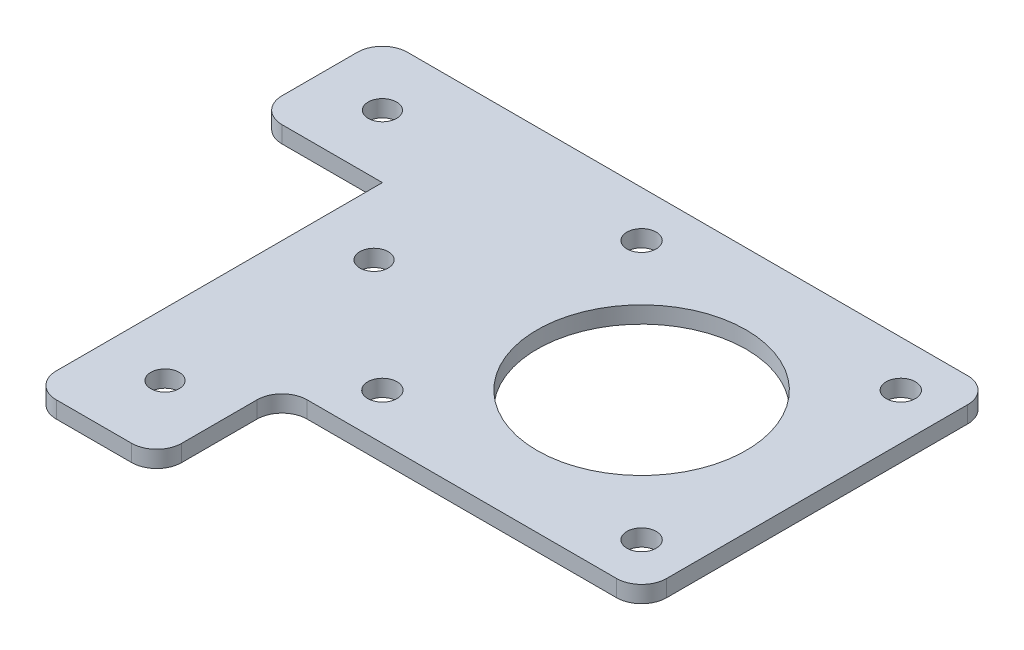
ISO-10303-21;
HEADER;
FILE_DESCRIPTION(('STEP AP214'),'2;1');
FILE_NAME('part.step','',(''),(''),'','','');
FILE_SCHEMA(('AUTOMOTIVE_DESIGN { 1 0 10303 214 1 1 1 1 }'));
ENDSEC;
DATA;
#1=APPLICATION_CONTEXT('core data for automotive mechanical design processes');
#2=APPLICATION_PROTOCOL_DEFINITION('international standard','automotive_design',2000,#1);
#3=PRODUCT_CONTEXT('',#1,'mechanical');
#4=PRODUCT('Part','Part','',(#3));
#5=PRODUCT_RELATED_PRODUCT_CATEGORY('part','',(#4));
#6=PRODUCT_DEFINITION_FORMATION('','',#4);
#7=PRODUCT_DEFINITION_CONTEXT('part definition',#1,'design');
#8=PRODUCT_DEFINITION('design','',#6,#7);
#9=PRODUCT_DEFINITION_SHAPE('','',#8);
#10=(LENGTH_UNIT() NAMED_UNIT(*) SI_UNIT(.MILLI.,.METRE.));
#11=(NAMED_UNIT(*) PLANE_ANGLE_UNIT() SI_UNIT($,.RADIAN.));
#12=(NAMED_UNIT(*) SI_UNIT($,.STERADIAN.) SOLID_ANGLE_UNIT());
#13=UNCERTAINTY_MEASURE_WITH_UNIT(LENGTH_MEASURE(1.E-05),#10,'distance_accuracy_value','');
#14=(GEOMETRIC_REPRESENTATION_CONTEXT(3) GLOBAL_UNCERTAINTY_ASSIGNED_CONTEXT((#13)) GLOBAL_UNIT_ASSIGNED_CONTEXT((#10,
#11,#12)) REPRESENTATION_CONTEXT('',''));
#15=CARTESIAN_POINT('',(0.,0.,0.));
#16=DIRECTION('',(0.,0.,1.));
#17=DIRECTION('',(1.,0.,0.));
#18=AXIS2_PLACEMENT_3D('',#15,#16,#17);
#19=CARTESIAN_POINT('',(3.,2.,39.));
#20=DIRECTION('',(0.,1.,0.));
#21=DIRECTION('',(0.,0.,1.));
#22=AXIS2_PLACEMENT_3D('',#19,#20,#21);
#23=PLANE('',#22);
#24=CARTESIAN_POINT('',(7.5,2.,33.5));
#25=DIRECTION('',(0.,1.,0.));
#26=DIRECTION('',(0.,0.,1.));
#27=AXIS2_PLACEMENT_3D('',#24,#25,#26);
#28=CIRCLE('',#27,1.7);
#29=CARTESIAN_POINT('',(7.5,2.,35.2));
#30=VERTEX_POINT('',#29);
#31=EDGE_CURVE('E592',#30,#30,#28,.T.);
#32=ORIENTED_EDGE('',*,*,#31,.F.);
#33=EDGE_LOOP('',(#32));
#34=FACE_BOUND('',#33,.T.);
#35=CARTESIAN_POINT('',(52.5,2.,-9.5));
#36=DIRECTION('',(0.,1.,0.));
#37=DIRECTION('',(0.,0.,-1.));
#38=AXIS2_PLACEMENT_3D('',#35,#36,#37);
#39=CIRCLE('',#38,1.75);
#40=CARTESIAN_POINT('',(52.5,2.,-11.25));
#41=VERTEX_POINT('',#40);
#42=EDGE_CURVE('E604',#41,#41,#39,.T.);
#43=ORIENTED_EDGE('',*,*,#42,.F.);
#44=EDGE_LOOP('',(#43));
#45=FACE_BOUND('',#44,.T.);
#46=CARTESIAN_POINT('',(21.5,2.,21.5));
#47=DIRECTION('',(0.,1.,0.));
#48=DIRECTION('',(0.,0.,1.));
#49=AXIS2_PLACEMENT_3D('',#46,#47,#48);
#50=CIRCLE('',#49,1.75);
#51=CARTESIAN_POINT('',(21.5,2.,23.25));
#52=VERTEX_POINT('',#51);
#53=EDGE_CURVE('E616',#52,#52,#50,.T.);
#54=ORIENTED_EDGE('',*,*,#53,.F.);
#55=EDGE_LOOP('',(#54));
#56=FACE_BOUND('',#55,.T.);
#57=CARTESIAN_POINT('',(37.,2.,6.));
#58=DIRECTION('',(0.,1.,0.));
#59=DIRECTION('',(0.,0.,1.));
#60=AXIS2_PLACEMENT_3D('',#57,#58,#59);
#61=CIRCLE('',#60,12.5);
#62=CARTESIAN_POINT('',(37.,2.,18.5));
#63=VERTEX_POINT('',#62);
#64=EDGE_CURVE('E180',#63,#63,#61,.T.);
#65=ORIENTED_EDGE('',*,*,#64,.F.);
#66=EDGE_LOOP('',(#65));
#67=FACE_BOUND('',#66,.T.);
#68=DIRECTION('',(0.,0.,1.));
#69=VECTOR('',#68,1.);
#70=CARTESIAN_POINT('',(0.,2.,0.));
#71=LINE('',#70,#69);
#72=CARTESIAN_POINT('',(0.,2.,0.));
#73=VERTEX_POINT('',#72);
#74=CARTESIAN_POINT('',(0.,2.,39.));
#75=VERTEX_POINT('',#74);
#76=EDGE_CURVE('E119',#73,#75,#71,.T.);
#77=ORIENTED_EDGE('',*,*,#76,.T.);
#78=CARTESIAN_POINT('',(3.,2.,39.));
#79=DIRECTION('',(0.,1.,0.));
#80=DIRECTION('',(0.,0.,1.));
#81=AXIS2_PLACEMENT_3D('',#78,#79,#80);
#82=CIRCLE('',#81,3.);
#83=CARTESIAN_POINT('',(3.00000000000002,2.,42.));
#84=VERTEX_POINT('',#83);
#85=EDGE_CURVE('E290',#75,#84,#82,.T.);
#86=ORIENTED_EDGE('',*,*,#85,.T.);
#87=DIRECTION('',(1.,0.,0.));
#88=VECTOR('',#87,1.);
#89=CARTESIAN_POINT('',(12.,2.,42.));
#90=LINE('',#89,#88);
#91=CARTESIAN_POINT('',(12.,2.,42.));
#92=VERTEX_POINT('',#91);
#93=EDGE_CURVE('E244',#84,#92,#90,.T.);
#94=ORIENTED_EDGE('',*,*,#93,.T.);
#95=CARTESIAN_POINT('',(12.,2.,39.));
#96=DIRECTION('',(0.,1.,0.));
#97=DIRECTION('',(0.,0.,1.));
#98=AXIS2_PLACEMENT_3D('',#95,#96,#97);
#99=CIRCLE('',#98,3.);
#100=CARTESIAN_POINT('',(15.,2.,39.));
#101=VERTEX_POINT('',#100);
#102=EDGE_CURVE('E263',#92,#101,#99,.T.);
#103=ORIENTED_EDGE('',*,*,#102,.T.);
#104=DIRECTION('',(0.,0.,-1.));
#105=VECTOR('',#104,1.);
#106=CARTESIAN_POINT('',(15.,2.,30.));
#107=LINE('',#106,#105);
#108=CARTESIAN_POINT('',(15.,2.,30.));
#109=VERTEX_POINT('',#108);
#110=EDGE_CURVE('E260',#101,#109,#107,.T.);
#111=ORIENTED_EDGE('',*,*,#110,.T.);
#112=CARTESIAN_POINT('',(18.,2.,30.));
#113=DIRECTION('',(0.,-1.,0.));
#114=DIRECTION('',(0.,0.,1.));
#115=AXIS2_PLACEMENT_3D('',#112,#113,#114);
#116=CIRCLE('',#115,3.);
#117=CARTESIAN_POINT('',(18.,2.,27.));
#118=VERTEX_POINT('',#117);
#119=EDGE_CURVE('E262',#109,#118,#116,.T.);
#120=ORIENTED_EDGE('',*,*,#119,.T.);
#121=DIRECTION('',(1.,0.,0.));
#122=VECTOR('',#121,1.);
#123=CARTESIAN_POINT('',(55.,2.,27.));
#124=LINE('',#123,#122);
#125=CARTESIAN_POINT('',(55.,2.,27.));
#126=VERTEX_POINT('',#125);
#127=EDGE_CURVE('E265',#118,#126,#124,.T.);
#128=ORIENTED_EDGE('',*,*,#127,.T.);
#129=CARTESIAN_POINT('',(55.,2.,24.));
#130=DIRECTION('',(0.,1.,0.));
#131=DIRECTION('',(0.,0.,1.));
#132=AXIS2_PLACEMENT_3D('',#129,#130,#131);
#133=CIRCLE('',#132,3.);
#134=CARTESIAN_POINT('',(58.,2.,24.));
#135=VERTEX_POINT('',#134);
#136=EDGE_CURVE('E271',#126,#135,#133,.T.);
#137=ORIENTED_EDGE('',*,*,#136,.T.);
#138=DIRECTION('',(0.,0.,-1.));
#139=VECTOR('',#138,1.);
#140=CARTESIAN_POINT('',(58.,2.,-12.));
#141=LINE('',#140,#139);
#142=CARTESIAN_POINT('',(58.,2.,-12.));
#143=VERTEX_POINT('',#142);
#144=EDGE_CURVE('E273',#135,#143,#141,.T.);
#145=ORIENTED_EDGE('',*,*,#144,.T.);
#146=CARTESIAN_POINT('',(55.,2.,-12.));
#147=DIRECTION('',(0.,1.,0.));
#148=DIRECTION('',(0.,0.,1.));
#149=AXIS2_PLACEMENT_3D('',#146,#147,#148);
#150=CIRCLE('',#149,3.);
#151=CARTESIAN_POINT('',(55.,2.,-15.));
#152=VERTEX_POINT('',#151);
#153=EDGE_CURVE('E275',#143,#152,#150,.T.);
#154=ORIENTED_EDGE('',*,*,#153,.T.);
#155=DIRECTION('',(-1.,0.,0.));
#156=VECTOR('',#155,1.);
#157=CARTESIAN_POINT('',(15.,2.,-15.));
#158=LINE('',#157,#156);
#159=CARTESIAN_POINT('',(-12.,2.,-15.));
#160=VERTEX_POINT('',#159);
#161=EDGE_CURVE('E277',#152,#160,#158,.T.);
#162=ORIENTED_EDGE('',*,*,#161,.T.);
#163=CARTESIAN_POINT('',(-12.,2.,-12.));
#164=DIRECTION('',(0.,1.,0.));
#165=DIRECTION('',(0.,0.,-1.));
#166=AXIS2_PLACEMENT_3D('',#163,#164,#165);
#167=CIRCLE('',#166,3.);
#168=CARTESIAN_POINT('',(-15.,2.,-12.));
#169=VERTEX_POINT('',#168);
#170=EDGE_CURVE('E160',#160,#169,#167,.T.);
#171=ORIENTED_EDGE('',*,*,#170,.T.);
#172=DIRECTION('',(0.,0.,1.));
#173=VECTOR('',#172,1.);
#174=CARTESIAN_POINT('',(-15.,2.,-12.));
#175=LINE('',#174,#173);
#176=CARTESIAN_POINT('',(-15.,2.,-3.));
#177=VERTEX_POINT('',#176);
#178=EDGE_CURVE('E154',#169,#177,#175,.T.);
#179=ORIENTED_EDGE('',*,*,#178,.T.);
#180=CARTESIAN_POINT('',(-12.,2.,-3.));
#181=DIRECTION('',(0.,1.,0.));
#182=DIRECTION('',(0.,0.,-1.));
#183=AXIS2_PLACEMENT_3D('',#180,#181,#182);
#184=CIRCLE('',#183,3.);
#185=CARTESIAN_POINT('',(-12.,2.,0.));
#186=VERTEX_POINT('',#185);
#187=EDGE_CURVE('E158',#177,#186,#184,.T.);
#188=ORIENTED_EDGE('',*,*,#187,.T.);
#189=DIRECTION('',(1.,0.,0.));
#190=VECTOR('',#189,1.);
#191=CARTESIAN_POINT('',(0.,2.,0.));
#192=LINE('',#191,#190);
#193=EDGE_CURVE('E56',#186,#73,#192,.T.);
#194=ORIENTED_EDGE('',*,*,#193,.T.);
#195=EDGE_LOOP('',(#77,#86,#94,#103,#111,#120,#128,#137,#145,#154,#162,#171,#179,#188,#194));
#196=FACE_BOUND('',#195,.T.);
#197=CARTESIAN_POINT('',(52.5,2.,21.5));
#198=DIRECTION('',(0.,1.,0.));
#199=DIRECTION('',(0.,0.,1.));
#200=AXIS2_PLACEMENT_3D('',#197,#198,#199);
#201=CIRCLE('',#200,1.75);
#202=CARTESIAN_POINT('',(52.5,2.,23.25));
#203=VERTEX_POINT('',#202);
#204=EDGE_CURVE('E622',#203,#203,#201,.T.);
#205=ORIENTED_EDGE('',*,*,#204,.F.);
#206=EDGE_LOOP('',(#205));
#207=FACE_BOUND('',#206,.T.);
#208=CARTESIAN_POINT('',(21.5,2.,-9.50000000000001));
#209=DIRECTION('',(0.,1.,0.));
#210=DIRECTION('',(0.,0.,-1.));
#211=AXIS2_PLACEMENT_3D('',#208,#209,#210);
#212=CIRCLE('',#211,1.75);
#213=CARTESIAN_POINT('',(21.5,2.,-11.25));
#214=VERTEX_POINT('',#213);
#215=EDGE_CURVE('E610',#214,#214,#212,.T.);
#216=ORIENTED_EDGE('',*,*,#215,.F.);
#217=EDGE_LOOP('',(#216));
#218=FACE_BOUND('',#217,.T.);
#219=CARTESIAN_POINT('',(7.5,2.,8.5));
#220=DIRECTION('',(0.,1.,0.));
#221=DIRECTION('',(0.,0.,1.));
#222=AXIS2_PLACEMENT_3D('',#219,#220,#221);
#223=CIRCLE('',#222,1.7);
#224=CARTESIAN_POINT('',(7.5,2.,10.2));
#225=VERTEX_POINT('',#224);
#226=EDGE_CURVE('E598',#225,#225,#223,.T.);
#227=ORIENTED_EDGE('',*,*,#226,.F.);
#228=EDGE_LOOP('',(#227));
#229=FACE_BOUND('',#228,.T.);
#230=CARTESIAN_POINT('',(-7.5,2.,-7.5));
#231=DIRECTION('',(0.,1.,0.));
#232=DIRECTION('',(0.,0.,1.));
#233=AXIS2_PLACEMENT_3D('',#230,#231,#232);
#234=CIRCLE('',#233,1.7);
#235=CARTESIAN_POINT('',(-7.5,2.,-5.8));
#236=VERTEX_POINT('',#235);
#237=EDGE_CURVE('E583',#236,#236,#234,.T.);
#238=ORIENTED_EDGE('',*,*,#237,.F.);
#239=EDGE_LOOP('',(#238));
#240=FACE_BOUND('',#239,.T.);
#241=ADVANCED_FACE('F39',(#34,#45,#56,#67,#196,#207,#218,#229,#240),#23,.T.);
#242=CARTESIAN_POINT('',(3.,0.,39.));
#243=DIRECTION('',(0.,1.,0.));
#244=DIRECTION('',(0.,0.,1.));
#245=AXIS2_PLACEMENT_3D('',#242,#243,#244);
#246=PLANE('',#245);
#247=DIRECTION('',(0.,0.,1.));
#248=VECTOR('',#247,1.);
#249=CARTESIAN_POINT('',(0.,0.,39.));
#250=LINE('',#249,#248);
#251=CARTESIAN_POINT('',(0.,0.,0.));
#252=VERTEX_POINT('',#251);
#253=CARTESIAN_POINT('',(0.,0.,39.));
#254=VERTEX_POINT('',#253);
#255=EDGE_CURVE('E113',#252,#254,#250,.T.);
#256=ORIENTED_EDGE('',*,*,#255,.F.);
#257=DIRECTION('',(1.,0.,0.));
#258=VECTOR('',#257,1.);
#259=CARTESIAN_POINT('',(0.,0.,0.));
#260=LINE('',#259,#258);
#261=CARTESIAN_POINT('',(-12.,0.,0.));
#262=VERTEX_POINT('',#261);
#263=EDGE_CURVE('E205',#262,#252,#260,.T.);
#264=ORIENTED_EDGE('',*,*,#263,.F.);
#265=CARTESIAN_POINT('',(-12.,0.,-3.));
#266=DIRECTION('',(0.,1.,0.));
#267=DIRECTION('',(0.,0.,-1.));
#268=AXIS2_PLACEMENT_3D('',#265,#266,#267);
#269=CIRCLE('',#268,3.);
#270=CARTESIAN_POINT('',(-15.,0.,-3.));
#271=VERTEX_POINT('',#270);
#272=EDGE_CURVE('E106',#271,#262,#269,.T.);
#273=ORIENTED_EDGE('',*,*,#272,.F.);
#274=DIRECTION('',(0.,0.,1.));
#275=VECTOR('',#274,1.);
#276=CARTESIAN_POINT('',(-15.,0.,-12.));
#277=LINE('',#276,#275);
#278=CARTESIAN_POINT('',(-15.,0.,-12.));
#279=VERTEX_POINT('',#278);
#280=EDGE_CURVE('E168',#279,#271,#277,.T.);
#281=ORIENTED_EDGE('',*,*,#280,.F.);
#282=CARTESIAN_POINT('',(-12.,0.,-12.));
#283=DIRECTION('',(0.,1.,0.));
#284=DIRECTION('',(0.,0.,-1.));
#285=AXIS2_PLACEMENT_3D('',#282,#283,#284);
#286=CIRCLE('',#285,3.);
#287=CARTESIAN_POINT('',(-12.,0.,-15.));
#288=VERTEX_POINT('',#287);
#289=EDGE_CURVE('E201',#288,#279,#286,.T.);
#290=ORIENTED_EDGE('',*,*,#289,.F.);
#291=DIRECTION('',(-1.,0.,0.));
#292=VECTOR('',#291,1.);
#293=CARTESIAN_POINT('',(15.,0.,-15.));
#294=LINE('',#293,#292);
#295=CARTESIAN_POINT('',(55.,0.,-15.));
#296=VERTEX_POINT('',#295);
#297=EDGE_CURVE('E199',#296,#288,#294,.T.);
#298=ORIENTED_EDGE('',*,*,#297,.F.);
#299=CARTESIAN_POINT('',(55.,0.,-12.));
#300=DIRECTION('',(0.,1.,0.));
#301=DIRECTION('',(0.,0.,1.));
#302=AXIS2_PLACEMENT_3D('',#299,#300,#301);
#303=CIRCLE('',#302,3.);
#304=CARTESIAN_POINT('',(58.,0.,-12.));
#305=VERTEX_POINT('',#304);
#306=EDGE_CURVE('E196',#305,#296,#303,.T.);
#307=ORIENTED_EDGE('',*,*,#306,.F.);
#308=DIRECTION('',(0.,0.,-1.));
#309=VECTOR('',#308,1.);
#310=CARTESIAN_POINT('',(58.,0.,-12.));
#311=LINE('',#310,#309);
#312=CARTESIAN_POINT('',(58.,0.,24.));
#313=VERTEX_POINT('',#312);
#314=EDGE_CURVE('E194',#313,#305,#311,.T.);
#315=ORIENTED_EDGE('',*,*,#314,.F.);
#316=CARTESIAN_POINT('',(55.,0.,24.));
#317=DIRECTION('',(0.,1.,0.));
#318=DIRECTION('',(0.,0.,1.));
#319=AXIS2_PLACEMENT_3D('',#316,#317,#318);
#320=CIRCLE('',#319,3.);
#321=CARTESIAN_POINT('',(55.,0.,27.));
#322=VERTEX_POINT('',#321);
#323=EDGE_CURVE('E192',#322,#313,#320,.T.);
#324=ORIENTED_EDGE('',*,*,#323,.F.);
#325=DIRECTION('',(1.,0.,0.));
#326=VECTOR('',#325,1.);
#327=CARTESIAN_POINT('',(55.,0.,27.));
#328=LINE('',#327,#326);
#329=CARTESIAN_POINT('',(18.,0.,27.));
#330=VERTEX_POINT('',#329);
#331=EDGE_CURVE('E190',#330,#322,#328,.T.);
#332=ORIENTED_EDGE('',*,*,#331,.F.);
#333=CARTESIAN_POINT('',(18.,0.,30.));
#334=DIRECTION('',(0.,-1.,0.));
#335=DIRECTION('',(0.,0.,1.));
#336=AXIS2_PLACEMENT_3D('',#333,#334,#335);
#337=CIRCLE('',#336,3.);
#338=CARTESIAN_POINT('',(15.,0.,30.));
#339=VERTEX_POINT('',#338);
#340=EDGE_CURVE('E188',#339,#330,#337,.T.);
#341=ORIENTED_EDGE('',*,*,#340,.F.);
#342=DIRECTION('',(0.,0.,-1.));
#343=VECTOR('',#342,1.);
#344=CARTESIAN_POINT('',(15.,0.,30.));
#345=LINE('',#344,#343);
#346=CARTESIAN_POINT('',(15.,0.,39.));
#347=VERTEX_POINT('',#346);
#348=EDGE_CURVE('E186',#347,#339,#345,.T.);
#349=ORIENTED_EDGE('',*,*,#348,.F.);
#350=CARTESIAN_POINT('',(12.,0.,39.));
#351=DIRECTION('',(0.,1.,0.));
#352=DIRECTION('',(0.,0.,1.));
#353=AXIS2_PLACEMENT_3D('',#350,#351,#352);
#354=CIRCLE('',#353,3.);
#355=CARTESIAN_POINT('',(12.,0.,42.));
#356=VERTEX_POINT('',#355);
#357=EDGE_CURVE('E184',#356,#347,#354,.T.);
#358=ORIENTED_EDGE('',*,*,#357,.F.);
#359=DIRECTION('',(1.,0.,0.));
#360=VECTOR('',#359,1.);
#361=CARTESIAN_POINT('',(12.,0.,42.));
#362=LINE('',#361,#360);
#363=CARTESIAN_POINT('',(3.00000000000002,0.,42.));
#364=VERTEX_POINT('',#363);
#365=EDGE_CURVE('E182',#364,#356,#362,.T.);
#366=ORIENTED_EDGE('',*,*,#365,.F.);
#367=CARTESIAN_POINT('',(3.,0.,39.));
#368=DIRECTION('',(0.,1.,0.));
#369=DIRECTION('',(0.,0.,1.));
#370=AXIS2_PLACEMENT_3D('',#367,#368,#369);
#371=CIRCLE('',#370,3.);
#372=EDGE_CURVE('E179',#254,#364,#371,.T.);
#373=ORIENTED_EDGE('',*,*,#372,.F.);
#374=EDGE_LOOP('',(#256,#264,#273,#281,#290,#298,#307,#315,#324,#332,#341,#349,#358,#366,#373));
#375=FACE_BOUND('',#374,.T.);
#376=CARTESIAN_POINT('',(37.,0.,6.));
#377=DIRECTION('',(0.,1.,0.));
#378=DIRECTION('',(0.,0.,1.));
#379=AXIS2_PLACEMENT_3D('',#376,#377,#378);
#380=CIRCLE('',#379,12.5);
#381=CARTESIAN_POINT('',(37.,0.,18.5));
#382=VERTEX_POINT('',#381);
#383=EDGE_CURVE('E294',#382,#382,#380,.T.);
#384=ORIENTED_EDGE('',*,*,#383,.T.);
#385=EDGE_LOOP('',(#384));
#386=FACE_BOUND('',#385,.T.);
#387=CARTESIAN_POINT('',(52.5,0.,21.5));
#388=DIRECTION('',(0.,1.,0.));
#389=DIRECTION('',(0.,0.,1.));
#390=AXIS2_PLACEMENT_3D('',#387,#388,#389);
#391=CIRCLE('',#390,1.75);
#392=CARTESIAN_POINT('',(52.5,0.,23.25));
#393=VERTEX_POINT('',#392);
#394=EDGE_CURVE('E619',#393,#393,#391,.T.);
#395=ORIENTED_EDGE('',*,*,#394,.T.);
#396=EDGE_LOOP('',(#395));
#397=FACE_BOUND('',#396,.T.);
#398=CARTESIAN_POINT('',(21.5,0.,21.5));
#399=DIRECTION('',(0.,1.,0.));
#400=DIRECTION('',(0.,0.,1.));
#401=AXIS2_PLACEMENT_3D('',#398,#399,#400);
#402=CIRCLE('',#401,1.75);
#403=CARTESIAN_POINT('',(21.5,0.,23.25));
#404=VERTEX_POINT('',#403);
#405=EDGE_CURVE('E613',#404,#404,#402,.T.);
#406=ORIENTED_EDGE('',*,*,#405,.T.);
#407=EDGE_LOOP('',(#406));
#408=FACE_BOUND('',#407,.T.);
#409=CARTESIAN_POINT('',(21.5,0.,-9.50000000000001));
#410=DIRECTION('',(0.,1.,0.));
#411=DIRECTION('',(0.,0.,-1.));
#412=AXIS2_PLACEMENT_3D('',#409,#410,#411);
#413=CIRCLE('',#412,1.75);
#414=CARTESIAN_POINT('',(21.5,0.,-11.25));
#415=VERTEX_POINT('',#414);
#416=EDGE_CURVE('E607',#415,#415,#413,.T.);
#417=ORIENTED_EDGE('',*,*,#416,.T.);
#418=EDGE_LOOP('',(#417));
#419=FACE_BOUND('',#418,.T.);
#420=CARTESIAN_POINT('',(52.5,0.,-9.5));
#421=DIRECTION('',(0.,1.,0.));
#422=DIRECTION('',(0.,0.,-1.));
#423=AXIS2_PLACEMENT_3D('',#420,#421,#422);
#424=CIRCLE('',#423,1.75);
#425=CARTESIAN_POINT('',(52.5,0.,-11.25));
#426=VERTEX_POINT('',#425);
#427=EDGE_CURVE('E601',#426,#426,#424,.T.);
#428=ORIENTED_EDGE('',*,*,#427,.T.);
#429=EDGE_LOOP('',(#428));
#430=FACE_BOUND('',#429,.T.);
#431=CARTESIAN_POINT('',(7.5,0.,8.5));
#432=DIRECTION('',(0.,1.,0.));
#433=DIRECTION('',(0.,0.,1.));
#434=AXIS2_PLACEMENT_3D('',#431,#432,#433);
#435=CIRCLE('',#434,1.7);
#436=CARTESIAN_POINT('',(7.5,0.,10.2));
#437=VERTEX_POINT('',#436);
#438=EDGE_CURVE('E595',#437,#437,#435,.T.);
#439=ORIENTED_EDGE('',*,*,#438,.T.);
#440=EDGE_LOOP('',(#439));
#441=FACE_BOUND('',#440,.T.);
#442=CARTESIAN_POINT('',(7.5,0.,33.5));
#443=DIRECTION('',(0.,1.,0.));
#444=DIRECTION('',(0.,0.,1.));
#445=AXIS2_PLACEMENT_3D('',#442,#443,#444);
#446=CIRCLE('',#445,1.7);
#447=CARTESIAN_POINT('',(7.5,0.,35.2));
#448=VERTEX_POINT('',#447);
#449=EDGE_CURVE('E589',#448,#448,#446,.T.);
#450=ORIENTED_EDGE('',*,*,#449,.T.);
#451=EDGE_LOOP('',(#450));
#452=FACE_BOUND('',#451,.T.);
#453=CARTESIAN_POINT('',(-7.5,0.,-7.5));
#454=DIRECTION('',(0.,1.,0.));
#455=DIRECTION('',(0.,0.,1.));
#456=AXIS2_PLACEMENT_3D('',#453,#454,#455);
#457=CIRCLE('',#456,1.7);
#458=CARTESIAN_POINT('',(-7.5,0.,-5.8));
#459=VERTEX_POINT('',#458);
#460=EDGE_CURVE('E586',#459,#459,#457,.T.);
#461=ORIENTED_EDGE('',*,*,#460,.T.);
#462=EDGE_LOOP('',(#461));
#463=FACE_BOUND('',#462,.T.);
#464=ADVANCED_FACE('F248',(#375,#386,#397,#408,#419,#430,#441,#452,#463),#246,.F.);
#465=CARTESIAN_POINT('',(0.,2.,39.));
#466=DIRECTION('',(1.,0.,0.));
#467=DIRECTION('',(0.,0.,-1.));
#468=AXIS2_PLACEMENT_3D('',#465,#466,#467);
#469=PLANE('',#468);
#470=ORIENTED_EDGE('',*,*,#255,.T.);
#471=DIRECTION('',(0.,-1.,0.));
#472=VECTOR('',#471,1.);
#473=CARTESIAN_POINT('',(0.,2.,39.));
#474=LINE('',#473,#472);
#475=EDGE_CURVE('E11',#75,#254,#474,.T.);
#476=ORIENTED_EDGE('',*,*,#475,.F.);
#477=ORIENTED_EDGE('',*,*,#76,.F.);
#478=DIRECTION('',(0.,-1.,0.));
#479=VECTOR('',#478,1.);
#480=CARTESIAN_POINT('',(0.,2.,0.));
#481=LINE('',#480,#479);
#482=EDGE_CURVE('E174',#73,#252,#481,.T.);
#483=ORIENTED_EDGE('',*,*,#482,.T.);
#484=EDGE_LOOP('',(#470,#476,#477,#483));
#485=FACE_BOUND('',#484,.T.);
#486=ADVANCED_FACE('F41',(#485),#469,.F.);
#487=CARTESIAN_POINT('',(3.,2.,39.));
#488=DIRECTION('',(0.,-1.,0.));
#489=DIRECTION('',(0.,0.,-1.));
#490=AXIS2_PLACEMENT_3D('',#487,#488,#489);
#491=CYLINDRICAL_SURFACE('',#490,3.);
#492=ORIENTED_EDGE('',*,*,#372,.T.);
#493=DIRECTION('',(0.,-1.,0.));
#494=VECTOR('',#493,1.);
#495=CARTESIAN_POINT('',(3.00000000000002,2.,42.));
#496=LINE('',#495,#494);
#497=EDGE_CURVE('E48',#84,#364,#496,.T.);
#498=ORIENTED_EDGE('',*,*,#497,.F.);
#499=ORIENTED_EDGE('',*,*,#85,.F.);
#500=ORIENTED_EDGE('',*,*,#475,.T.);
#501=EDGE_LOOP('',(#492,#498,#499,#500));
#502=FACE_BOUND('',#501,.T.);
#503=ADVANCED_FACE('F296',(#502),#491,.T.);
#504=CARTESIAN_POINT('',(12.,2.,42.));
#505=DIRECTION('',(0.,0.,-1.));
#506=DIRECTION('',(-1.,0.,0.));
#507=AXIS2_PLACEMENT_3D('',#504,#505,#506);
#508=PLANE('',#507);
#509=ORIENTED_EDGE('',*,*,#365,.T.);
#510=DIRECTION('',(0.,-1.,0.));
#511=VECTOR('',#510,1.);
#512=CARTESIAN_POINT('',(12.,2.,42.));
#513=LINE('',#512,#511);
#514=EDGE_CURVE('E235',#92,#356,#513,.T.);
#515=ORIENTED_EDGE('',*,*,#514,.F.);
#516=ORIENTED_EDGE('',*,*,#93,.F.);
#517=ORIENTED_EDGE('',*,*,#497,.T.);
#518=EDGE_LOOP('',(#509,#515,#516,#517));
#519=FACE_BOUND('',#518,.T.);
#520=ADVANCED_FACE('F242',(#519),#508,.F.);
#521=CARTESIAN_POINT('',(12.,2.,39.));
#522=DIRECTION('',(0.,-1.,0.));
#523=DIRECTION('',(0.,0.,-1.));
#524=AXIS2_PLACEMENT_3D('',#521,#522,#523);
#525=CYLINDRICAL_SURFACE('',#524,3.);
#526=ORIENTED_EDGE('',*,*,#357,.T.);
#527=DIRECTION('',(0.,-1.,0.));
#528=VECTOR('',#527,1.);
#529=CARTESIAN_POINT('',(15.,2.,39.));
#530=LINE('',#529,#528);
#531=EDGE_CURVE('E232',#101,#347,#530,.T.);
#532=ORIENTED_EDGE('',*,*,#531,.F.);
#533=ORIENTED_EDGE('',*,*,#102,.F.);
#534=ORIENTED_EDGE('',*,*,#514,.T.);
#535=EDGE_LOOP('',(#526,#532,#533,#534));
#536=FACE_BOUND('',#535,.T.);
#537=ADVANCED_FACE('F254',(#536),#525,.T.);
#538=CARTESIAN_POINT('',(15.,2.,30.));
#539=DIRECTION('',(-1.,0.,0.));
#540=DIRECTION('',(0.,0.,1.));
#541=AXIS2_PLACEMENT_3D('',#538,#539,#540);
#542=PLANE('',#541);
#543=ORIENTED_EDGE('',*,*,#348,.T.);
#544=DIRECTION('',(0.,-1.,0.));
#545=VECTOR('',#544,1.);
#546=CARTESIAN_POINT('',(15.,2.,30.));
#547=LINE('',#546,#545);
#548=EDGE_CURVE('E229',#109,#339,#547,.T.);
#549=ORIENTED_EDGE('',*,*,#548,.F.);
#550=ORIENTED_EDGE('',*,*,#110,.F.);
#551=ORIENTED_EDGE('',*,*,#531,.T.);
#552=EDGE_LOOP('',(#543,#549,#550,#551));
#553=FACE_BOUND('',#552,.T.);
#554=ADVANCED_FACE('F258',(#553),#542,.F.);
#555=CARTESIAN_POINT('',(18.,2.,30.));
#556=DIRECTION('',(0.,-1.,0.));
#557=DIRECTION('',(0.,0.,-1.));
#558=AXIS2_PLACEMENT_3D('',#555,#556,#557);
#559=CYLINDRICAL_SURFACE('',#558,3.);
#560=ORIENTED_EDGE('',*,*,#340,.T.);
#561=DIRECTION('',(0.,-1.,0.));
#562=VECTOR('',#561,1.);
#563=CARTESIAN_POINT('',(18.,2.,27.));
#564=LINE('',#563,#562);
#565=EDGE_CURVE('E226',#118,#330,#564,.T.);
#566=ORIENTED_EDGE('',*,*,#565,.F.);
#567=ORIENTED_EDGE('',*,*,#119,.F.);
#568=ORIENTED_EDGE('',*,*,#548,.T.);
#569=EDGE_LOOP('',(#560,#566,#567,#568));
#570=FACE_BOUND('',#569,.T.);
#571=ADVANCED_FACE('F341',(#570),#559,.F.);
#572=CARTESIAN_POINT('',(55.,2.,27.));
#573=DIRECTION('',(0.,0.,-1.));
#574=DIRECTION('',(-1.,0.,0.));
#575=AXIS2_PLACEMENT_3D('',#572,#573,#574);
#576=PLANE('',#575);
#577=ORIENTED_EDGE('',*,*,#331,.T.);
#578=DIRECTION('',(0.,-1.,0.));
#579=VECTOR('',#578,1.);
#580=CARTESIAN_POINT('',(55.,2.,27.));
#581=LINE('',#580,#579);
#582=EDGE_CURVE('E223',#126,#322,#581,.T.);
#583=ORIENTED_EDGE('',*,*,#582,.F.);
#584=ORIENTED_EDGE('',*,*,#127,.F.);
#585=ORIENTED_EDGE('',*,*,#565,.T.);
#586=EDGE_LOOP('',(#577,#583,#584,#585));
#587=FACE_BOUND('',#586,.T.);
#588=ADVANCED_FACE('F337',(#587),#576,.F.);
#589=CARTESIAN_POINT('',(55.,2.,24.));
#590=DIRECTION('',(0.,-1.,0.));
#591=DIRECTION('',(0.,0.,-1.));
#592=AXIS2_PLACEMENT_3D('',#589,#590,#591);
#593=CYLINDRICAL_SURFACE('',#592,3.);
#594=ORIENTED_EDGE('',*,*,#323,.T.);
#595=DIRECTION('',(0.,-1.,0.));
#596=VECTOR('',#595,1.);
#597=CARTESIAN_POINT('',(58.,2.,24.));
#598=LINE('',#597,#596);
#599=EDGE_CURVE('E220',#135,#313,#598,.T.);
#600=ORIENTED_EDGE('',*,*,#599,.F.);
#601=ORIENTED_EDGE('',*,*,#136,.F.);
#602=ORIENTED_EDGE('',*,*,#582,.T.);
#603=EDGE_LOOP('',(#594,#600,#601,#602));
#604=FACE_BOUND('',#603,.T.);
#605=ADVANCED_FACE('F333',(#604),#593,.T.);
#606=CARTESIAN_POINT('',(58.,2.,-12.));
#607=DIRECTION('',(-1.,0.,0.));
#608=DIRECTION('',(0.,0.,1.));
#609=AXIS2_PLACEMENT_3D('',#606,#607,#608);
#610=PLANE('',#609);
#611=ORIENTED_EDGE('',*,*,#314,.T.);
#612=DIRECTION('',(0.,-1.,0.));
#613=VECTOR('',#612,1.);
#614=CARTESIAN_POINT('',(58.,2.,-12.));
#615=LINE('',#614,#613);
#616=EDGE_CURVE('E217',#143,#305,#615,.T.);
#617=ORIENTED_EDGE('',*,*,#616,.F.);
#618=ORIENTED_EDGE('',*,*,#144,.F.);
#619=ORIENTED_EDGE('',*,*,#599,.T.);
#620=EDGE_LOOP('',(#611,#617,#618,#619));
#621=FACE_BOUND('',#620,.T.);
#622=ADVANCED_FACE('F329',(#621),#610,.F.);
#623=CARTESIAN_POINT('',(55.,2.,-12.));
#624=DIRECTION('',(0.,-1.,0.));
#625=DIRECTION('',(0.,0.,-1.));
#626=AXIS2_PLACEMENT_3D('',#623,#624,#625);
#627=CYLINDRICAL_SURFACE('',#626,3.);
#628=ORIENTED_EDGE('',*,*,#306,.T.);
#629=DIRECTION('',(0.,-1.,0.));
#630=VECTOR('',#629,1.);
#631=CARTESIAN_POINT('',(55.,2.,-15.));
#632=LINE('',#631,#630);
#633=EDGE_CURVE('E214',#152,#296,#632,.T.);
#634=ORIENTED_EDGE('',*,*,#633,.F.);
#635=ORIENTED_EDGE('',*,*,#153,.F.);
#636=ORIENTED_EDGE('',*,*,#616,.T.);
#637=EDGE_LOOP('',(#628,#634,#635,#636));
#638=FACE_BOUND('',#637,.T.);
#639=ADVANCED_FACE('F326',(#638),#627,.T.);
#640=CARTESIAN_POINT('',(15.,2.,-15.));
#641=DIRECTION('',(0.,0.,1.));
#642=DIRECTION('',(1.,0.,0.));
#643=AXIS2_PLACEMENT_3D('',#640,#641,#642);
#644=PLANE('',#643);
#645=ORIENTED_EDGE('',*,*,#297,.T.);
#646=DIRECTION('',(0.,-1.,0.));
#647=VECTOR('',#646,1.);
#648=CARTESIAN_POINT('',(-12.,2.,-15.));
#649=LINE('',#648,#647);
#650=EDGE_CURVE('E211',#160,#288,#649,.T.);
#651=ORIENTED_EDGE('',*,*,#650,.F.);
#652=ORIENTED_EDGE('',*,*,#161,.F.);
#653=ORIENTED_EDGE('',*,*,#633,.T.);
#654=EDGE_LOOP('',(#645,#651,#652,#653));
#655=FACE_BOUND('',#654,.T.);
#656=ADVANCED_FACE('F283',(#655),#644,.F.);
#657=CARTESIAN_POINT('',(-12.,2.,-12.));
#658=DIRECTION('',(0.,-1.,0.));
#659=DIRECTION('',(0.,0.,-1.));
#660=AXIS2_PLACEMENT_3D('',#657,#658,#659);
#661=CYLINDRICAL_SURFACE('',#660,3.);
#662=ORIENTED_EDGE('',*,*,#289,.T.);
#663=DIRECTION('',(0.,-1.,0.));
#664=VECTOR('',#663,1.);
#665=CARTESIAN_POINT('',(-15.,2.,-12.));
#666=LINE('',#665,#664);
#667=EDGE_CURVE('E169',#169,#279,#666,.T.);
#668=ORIENTED_EDGE('',*,*,#667,.F.);
#669=ORIENTED_EDGE('',*,*,#170,.F.);
#670=ORIENTED_EDGE('',*,*,#650,.T.);
#671=EDGE_LOOP('',(#662,#668,#669,#670));
#672=FACE_BOUND('',#671,.T.);
#673=ADVANCED_FACE('F286',(#672),#661,.T.);
#674=CARTESIAN_POINT('',(-15.,2.,-12.));
#675=DIRECTION('',(1.,0.,0.));
#676=DIRECTION('',(0.,0.,-1.));
#677=AXIS2_PLACEMENT_3D('',#674,#675,#676);
#678=PLANE('',#677);
#679=ORIENTED_EDGE('',*,*,#280,.T.);
#680=DIRECTION('',(0.,-1.,0.));
#681=VECTOR('',#680,1.);
#682=CARTESIAN_POINT('',(-15.,2.,-3.));
#683=LINE('',#682,#681);
#684=EDGE_CURVE('E165',#177,#271,#683,.T.);
#685=ORIENTED_EDGE('',*,*,#684,.F.);
#686=ORIENTED_EDGE('',*,*,#178,.F.);
#687=ORIENTED_EDGE('',*,*,#667,.T.);
#688=EDGE_LOOP('',(#679,#685,#686,#687));
#689=FACE_BOUND('',#688,.T.);
#690=ADVANCED_FACE('F166',(#689),#678,.F.);
#691=CARTESIAN_POINT('',(-12.,2.,-3.));
#692=DIRECTION('',(0.,-1.,0.));
#693=DIRECTION('',(0.,0.,-1.));
#694=AXIS2_PLACEMENT_3D('',#691,#692,#693);
#695=CYLINDRICAL_SURFACE('',#694,3.);
#696=ORIENTED_EDGE('',*,*,#272,.T.);
#697=DIRECTION('',(0.,-1.,0.));
#698=VECTOR('',#697,1.);
#699=CARTESIAN_POINT('',(-12.,2.,0.));
#700=LINE('',#699,#698);
#701=EDGE_CURVE('E170',#186,#262,#700,.T.);
#702=ORIENTED_EDGE('',*,*,#701,.F.);
#703=ORIENTED_EDGE('',*,*,#187,.F.);
#704=ORIENTED_EDGE('',*,*,#684,.T.);
#705=EDGE_LOOP('',(#696,#702,#703,#704));
#706=FACE_BOUND('',#705,.T.);
#707=ADVANCED_FACE('F172',(#706),#695,.T.);
#708=CARTESIAN_POINT('',(0.,2.,0.));
#709=DIRECTION('',(0.,0.,-1.));
#710=DIRECTION('',(-1.,0.,0.));
#711=AXIS2_PLACEMENT_3D('',#708,#709,#710);
#712=PLANE('',#711);
#713=ORIENTED_EDGE('',*,*,#263,.T.);
#714=ORIENTED_EDGE('',*,*,#482,.F.);
#715=ORIENTED_EDGE('',*,*,#193,.F.);
#716=ORIENTED_EDGE('',*,*,#701,.T.);
#717=EDGE_LOOP('',(#713,#714,#715,#716));
#718=FACE_BOUND('',#717,.T.);
#719=ADVANCED_FACE('F288',(#718),#712,.F.);
#720=CARTESIAN_POINT('',(37.,2.,6.));
#721=DIRECTION('',(0.,-1.,0.));
#722=DIRECTION('',(0.,0.,-1.));
#723=AXIS2_PLACEMENT_3D('',#720,#721,#722);
#724=CYLINDRICAL_SURFACE('',#723,12.5);
#725=ORIENTED_EDGE('',*,*,#64,.T.);
#726=EDGE_LOOP('',(#725));
#727=FACE_BOUND('',#726,.T.);
#728=ORIENTED_EDGE('',*,*,#383,.F.);
#729=EDGE_LOOP('',(#728));
#730=FACE_BOUND('',#729,.T.);
#731=ADVANCED_FACE('F313',(#727,#730),#724,.F.);
#732=CARTESIAN_POINT('',(52.5,2.,21.5));
#733=DIRECTION('',(0.,-1.,0.));
#734=DIRECTION('',(0.,0.,-1.));
#735=AXIS2_PLACEMENT_3D('',#732,#733,#734);
#736=CYLINDRICAL_SURFACE('',#735,1.75);
#737=ORIENTED_EDGE('',*,*,#204,.T.);
#738=EDGE_LOOP('',(#737));
#739=FACE_BOUND('',#738,.T.);
#740=ORIENTED_EDGE('',*,*,#394,.F.);
#741=EDGE_LOOP('',(#740));
#742=FACE_BOUND('',#741,.T.);
#743=ADVANCED_FACE('F403',(#739,#742),#736,.F.);
#744=CARTESIAN_POINT('',(21.5,2.,21.5));
#745=DIRECTION('',(0.,-1.,0.));
#746=DIRECTION('',(0.,0.,-1.));
#747=AXIS2_PLACEMENT_3D('',#744,#745,#746);
#748=CYLINDRICAL_SURFACE('',#747,1.75);
#749=ORIENTED_EDGE('',*,*,#53,.T.);
#750=EDGE_LOOP('',(#749));
#751=FACE_BOUND('',#750,.T.);
#752=ORIENTED_EDGE('',*,*,#405,.F.);
#753=EDGE_LOOP('',(#752));
#754=FACE_BOUND('',#753,.T.);
#755=ADVANCED_FACE('F410',(#751,#754),#748,.F.);
#756=CARTESIAN_POINT('',(21.5,2.,-9.50000000000001));
#757=DIRECTION('',(0.,-1.,0.));
#758=DIRECTION('',(0.,0.,-1.));
#759=AXIS2_PLACEMENT_3D('',#756,#757,#758);
#760=CYLINDRICAL_SURFACE('',#759,1.75);
#761=ORIENTED_EDGE('',*,*,#215,.T.);
#762=EDGE_LOOP('',(#761));
#763=FACE_BOUND('',#762,.T.);
#764=ORIENTED_EDGE('',*,*,#416,.F.);
#765=EDGE_LOOP('',(#764));
#766=FACE_BOUND('',#765,.T.);
#767=ADVANCED_FACE('F417',(#763,#766),#760,.F.);
#768=CARTESIAN_POINT('',(52.5,2.,-9.5));
#769=DIRECTION('',(0.,-1.,0.));
#770=DIRECTION('',(0.,0.,-1.));
#771=AXIS2_PLACEMENT_3D('',#768,#769,#770);
#772=CYLINDRICAL_SURFACE('',#771,1.75);
#773=ORIENTED_EDGE('',*,*,#42,.T.);
#774=EDGE_LOOP('',(#773));
#775=FACE_BOUND('',#774,.T.);
#776=ORIENTED_EDGE('',*,*,#427,.F.);
#777=EDGE_LOOP('',(#776));
#778=FACE_BOUND('',#777,.T.);
#779=ADVANCED_FACE('F425',(#775,#778),#772,.F.);
#780=CARTESIAN_POINT('',(7.5,2.,8.5));
#781=DIRECTION('',(0.,-1.,0.));
#782=DIRECTION('',(0.,0.,-1.));
#783=AXIS2_PLACEMENT_3D('',#780,#781,#782);
#784=CYLINDRICAL_SURFACE('',#783,1.7);
#785=ORIENTED_EDGE('',*,*,#226,.T.);
#786=EDGE_LOOP('',(#785));
#787=FACE_BOUND('',#786,.T.);
#788=ORIENTED_EDGE('',*,*,#438,.F.);
#789=EDGE_LOOP('',(#788));
#790=FACE_BOUND('',#789,.T.);
#791=ADVANCED_FACE('F433',(#787,#790),#784,.F.);
#792=CARTESIAN_POINT('',(7.5,2.,33.5));
#793=DIRECTION('',(0.,-1.,0.));
#794=DIRECTION('',(0.,0.,-1.));
#795=AXIS2_PLACEMENT_3D('',#792,#793,#794);
#796=CYLINDRICAL_SURFACE('',#795,1.7);
#797=ORIENTED_EDGE('',*,*,#31,.T.);
#798=EDGE_LOOP('',(#797));
#799=FACE_BOUND('',#798,.T.);
#800=ORIENTED_EDGE('',*,*,#449,.F.);
#801=EDGE_LOOP('',(#800));
#802=FACE_BOUND('',#801,.T.);
#803=ADVANCED_FACE('F441',(#799,#802),#796,.F.);
#804=CARTESIAN_POINT('',(-7.5,2.,-7.5));
#805=DIRECTION('',(0.,-1.,0.));
#806=DIRECTION('',(0.,0.,-1.));
#807=AXIS2_PLACEMENT_3D('',#804,#805,#806);
#808=CYLINDRICAL_SURFACE('',#807,1.7);
#809=ORIENTED_EDGE('',*,*,#237,.T.);
#810=EDGE_LOOP('',(#809));
#811=FACE_BOUND('',#810,.T.);
#812=ORIENTED_EDGE('',*,*,#460,.F.);
#813=EDGE_LOOP('',(#812));
#814=FACE_BOUND('',#813,.T.);
#815=ADVANCED_FACE('F449',(#811,#814),#808,.F.);
#816=CLOSED_SHELL('',(#241,#464,#486,#503,#520,#537,#554,#571,#588,#605,#622,#639,#656,#673,
#690,#707,#719,#731,#743,#755,#767,#779,#791,#803,#815));
#817=MANIFOLD_SOLID_BREP('B2',#816);
#818=ADVANCED_BREP_SHAPE_REPRESENTATION('',(#18,#817),#14);
#819=SHAPE_DEFINITION_REPRESENTATION(#9,#818);
ENDSEC;
END-ISO-10303-21;
